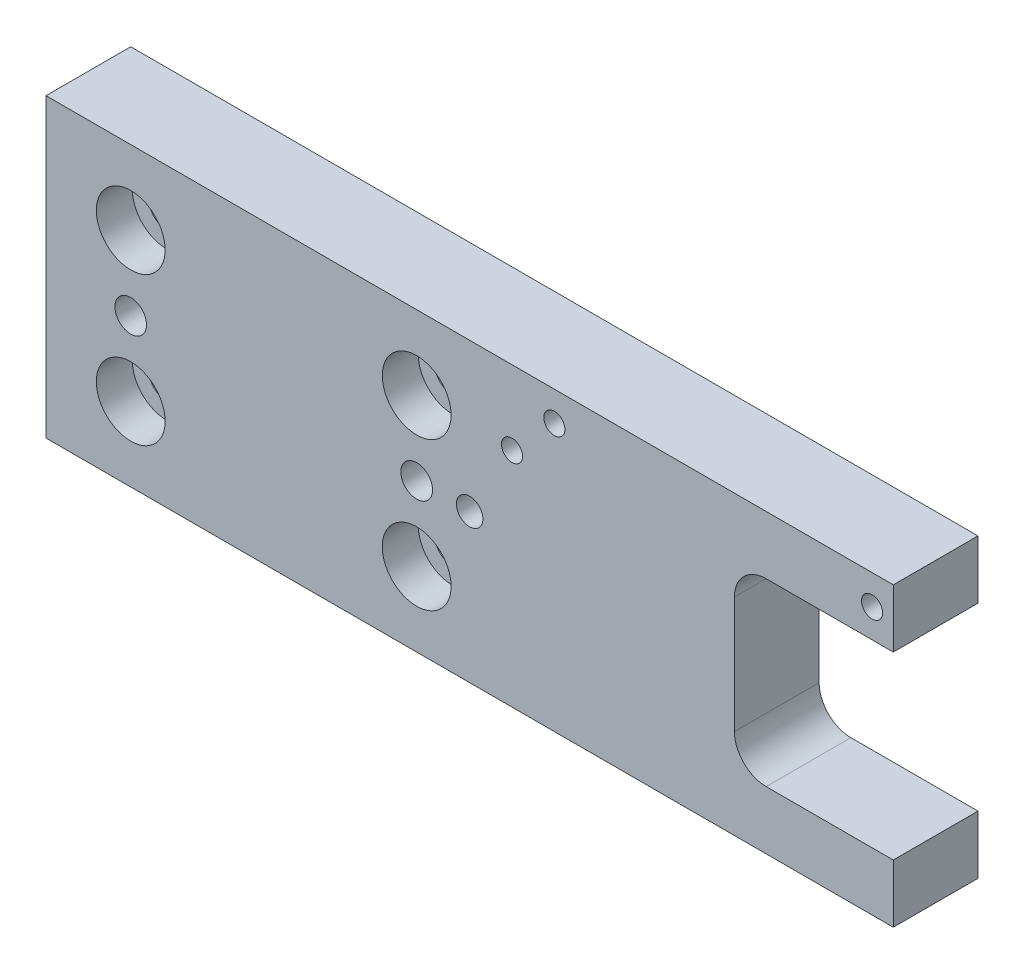
ISO-10303-21;
HEADER;
FILE_DESCRIPTION(('STEP AP214'),'2;1');
FILE_NAME('part.step','',(''),(''),'','','');
FILE_SCHEMA(('AUTOMOTIVE_DESIGN { 1 0 10303 214 1 1 1 1 }'));
ENDSEC;
DATA;
#1=APPLICATION_CONTEXT('core data for automotive mechanical design processes');
#2=APPLICATION_PROTOCOL_DEFINITION('international standard','automotive_design',2000,#1);
#3=PRODUCT_CONTEXT('',#1,'mechanical');
#4=PRODUCT('Part','Part','',(#3));
#5=PRODUCT_RELATED_PRODUCT_CATEGORY('part','',(#4));
#6=PRODUCT_DEFINITION_FORMATION('','',#4);
#7=PRODUCT_DEFINITION_CONTEXT('part definition',#1,'design');
#8=PRODUCT_DEFINITION('design','',#6,#7);
#9=PRODUCT_DEFINITION_SHAPE('','',#8);
#10=(LENGTH_UNIT() NAMED_UNIT(*) SI_UNIT(.MILLI.,.METRE.));
#11=(NAMED_UNIT(*) PLANE_ANGLE_UNIT() SI_UNIT($,.RADIAN.));
#12=(NAMED_UNIT(*) SI_UNIT($,.STERADIAN.) SOLID_ANGLE_UNIT());
#13=UNCERTAINTY_MEASURE_WITH_UNIT(LENGTH_MEASURE(1.E-05),#10,'distance_accuracy_value','');
#14=(GEOMETRIC_REPRESENTATION_CONTEXT(3) GLOBAL_UNCERTAINTY_ASSIGNED_CONTEXT((#13)) GLOBAL_UNIT_ASSIGNED_CONTEXT((#10,
#11,#12)) REPRESENTATION_CONTEXT('',''));
#15=CARTESIAN_POINT('',(0.,0.,0.));
#16=DIRECTION('',(0.,0.,1.));
#17=DIRECTION('',(1.,0.,0.));
#18=AXIS2_PLACEMENT_3D('',#15,#16,#17);
#19=CARTESIAN_POINT('',(8.00000000000003,7.,8.));
#20=DIRECTION('',(0.,0.,1.));
#21=DIRECTION('',(1.,0.,0.));
#22=AXIS2_PLACEMENT_3D('',#19,#20,#21);
#23=CYLINDRICAL_SURFACE('',#22,3.25);
#24=CARTESIAN_POINT('',(8.00000000000003,7.,8.));
#25=DIRECTION('',(0.,0.,1.));
#26=DIRECTION('',(1.,0.,0.));
#27=AXIS2_PLACEMENT_3D('',#24,#25,#26);
#28=CIRCLE('',#27,3.25);
#29=CARTESIAN_POINT('',(11.25,7.,8.));
#30=VERTEX_POINT('',#29);
#31=EDGE_CURVE('E271',#30,#30,#28,.F.);
#32=ORIENTED_EDGE('',*,*,#31,.F.);
#33=EDGE_LOOP('',(#32));
#34=FACE_BOUND('',#33,.T.);
#35=CARTESIAN_POINT('',(8.00000000000003,7.,4.6));
#36=DIRECTION('',(0.,0.,1.));
#37=DIRECTION('',(1.,0.,0.));
#38=AXIS2_PLACEMENT_3D('',#35,#36,#37);
#39=CIRCLE('',#38,3.25);
#40=CARTESIAN_POINT('',(11.25,7.,4.6));
#41=VERTEX_POINT('',#40);
#42=EDGE_CURVE('E19',#41,#41,#39,.F.);
#43=ORIENTED_EDGE('',*,*,#42,.T.);
#44=EDGE_LOOP('',(#43));
#45=FACE_BOUND('',#44,.T.);
#46=ADVANCED_FACE('F16',(#34,#45),#23,.F.);
#47=CARTESIAN_POINT('',(35.,7.,8.));
#48=DIRECTION('',(0.,0.,1.));
#49=DIRECTION('',(1.,0.,0.));
#50=AXIS2_PLACEMENT_3D('',#47,#48,#49);
#51=CYLINDRICAL_SURFACE('',#50,3.25);
#52=CARTESIAN_POINT('',(35.,7.,8.));
#53=DIRECTION('',(0.,0.,1.));
#54=DIRECTION('',(1.,0.,0.));
#55=AXIS2_PLACEMENT_3D('',#52,#53,#54);
#56=CIRCLE('',#55,3.25);
#57=CARTESIAN_POINT('',(38.25,7.,8.));
#58=VERTEX_POINT('',#57);
#59=EDGE_CURVE('E268',#58,#58,#56,.F.);
#60=ORIENTED_EDGE('',*,*,#59,.F.);
#61=EDGE_LOOP('',(#60));
#62=FACE_BOUND('',#61,.T.);
#63=CARTESIAN_POINT('',(35.,7.,4.6));
#64=DIRECTION('',(0.,0.,1.));
#65=DIRECTION('',(1.,0.,0.));
#66=AXIS2_PLACEMENT_3D('',#63,#64,#65);
#67=CIRCLE('',#66,3.25);
#68=CARTESIAN_POINT('',(38.25,7.,4.6));
#69=VERTEX_POINT('',#68);
#70=EDGE_CURVE('E279',#69,#69,#67,.F.);
#71=ORIENTED_EDGE('',*,*,#70,.T.);
#72=EDGE_LOOP('',(#71));
#73=FACE_BOUND('',#72,.T.);
#74=ADVANCED_FACE('F389',(#62,#73),#51,.F.);
#75=CARTESIAN_POINT('',(35.,-7.,8.));
#76=DIRECTION('',(0.,0.,1.));
#77=DIRECTION('',(1.,0.,0.));
#78=AXIS2_PLACEMENT_3D('',#75,#76,#77);
#79=CYLINDRICAL_SURFACE('',#78,3.25);
#80=CARTESIAN_POINT('',(35.,-7.,8.));
#81=DIRECTION('',(0.,0.,1.));
#82=DIRECTION('',(1.,0.,0.));
#83=AXIS2_PLACEMENT_3D('',#80,#81,#82);
#84=CIRCLE('',#83,3.25);
#85=CARTESIAN_POINT('',(38.25,-7.,8.));
#86=VERTEX_POINT('',#85);
#87=EDGE_CURVE('E265',#86,#86,#84,.F.);
#88=ORIENTED_EDGE('',*,*,#87,.F.);
#89=EDGE_LOOP('',(#88));
#90=FACE_BOUND('',#89,.T.);
#91=CARTESIAN_POINT('',(35.,-7.,4.6));
#92=DIRECTION('',(0.,0.,1.));
#93=DIRECTION('',(1.,0.,0.));
#94=AXIS2_PLACEMENT_3D('',#91,#92,#93);
#95=CIRCLE('',#94,3.25);
#96=CARTESIAN_POINT('',(38.25,-7.,4.6));
#97=VERTEX_POINT('',#96);
#98=EDGE_CURVE('E277',#97,#97,#95,.F.);
#99=ORIENTED_EDGE('',*,*,#98,.T.);
#100=EDGE_LOOP('',(#99));
#101=FACE_BOUND('',#100,.T.);
#102=ADVANCED_FACE('F386',(#90,#101),#79,.F.);
#103=CARTESIAN_POINT('',(8.00000000000003,-7.,8.));
#104=DIRECTION('',(0.,0.,1.));
#105=DIRECTION('',(1.,0.,0.));
#106=AXIS2_PLACEMENT_3D('',#103,#104,#105);
#107=CYLINDRICAL_SURFACE('',#106,3.25);
#108=CARTESIAN_POINT('',(8.00000000000003,-7.,8.));
#109=DIRECTION('',(0.,0.,1.));
#110=DIRECTION('',(1.,0.,0.));
#111=AXIS2_PLACEMENT_3D('',#108,#109,#110);
#112=CIRCLE('',#111,3.25);
#113=CARTESIAN_POINT('',(11.25,-7.,8.));
#114=VERTEX_POINT('',#113);
#115=EDGE_CURVE('E262',#114,#114,#112,.F.);
#116=ORIENTED_EDGE('',*,*,#115,.F.);
#117=EDGE_LOOP('',(#116));
#118=FACE_BOUND('',#117,.T.);
#119=CARTESIAN_POINT('',(8.00000000000003,-7.,4.6));
#120=DIRECTION('',(0.,0.,1.));
#121=DIRECTION('',(1.,0.,0.));
#122=AXIS2_PLACEMENT_3D('',#119,#120,#121);
#123=CIRCLE('',#122,3.25);
#124=CARTESIAN_POINT('',(11.25,-7.,4.6));
#125=VERTEX_POINT('',#124);
#126=EDGE_CURVE('E274',#125,#125,#123,.F.);
#127=ORIENTED_EDGE('',*,*,#126,.T.);
#128=EDGE_LOOP('',(#127));
#129=FACE_BOUND('',#128,.T.);
#130=ADVANCED_FACE('F291',(#118,#129),#107,.F.);
#131=CARTESIAN_POINT('',(9.70000000000003,7.,4.6));
#132=DIRECTION('',(0.,0.,-1.));
#133=DIRECTION('',(-1.,0.,0.));
#134=AXIS2_PLACEMENT_3D('',#131,#132,#133);
#135=PLANE('',#134);
#136=ORIENTED_EDGE('',*,*,#42,.F.);
#137=EDGE_LOOP('',(#136));
#138=FACE_BOUND('',#137,.T.);
#139=CARTESIAN_POINT('',(8.00000000000003,7.,4.6));
#140=DIRECTION('',(0.,0.,1.));
#141=DIRECTION('',(1.,0.,0.));
#142=AXIS2_PLACEMENT_3D('',#139,#140,#141);
#143=CIRCLE('',#142,1.7);
#144=CARTESIAN_POINT('',(9.70000000000003,7.,4.6));
#145=VERTEX_POINT('',#144);
#146=EDGE_CURVE('E241',#145,#145,#143,.F.);
#147=ORIENTED_EDGE('',*,*,#146,.T.);
#148=EDGE_LOOP('',(#147));
#149=FACE_BOUND('',#148,.T.);
#150=ADVANCED_FACE('F287',(#138,#149),#135,.F.);
#151=CARTESIAN_POINT('',(36.7,7.,4.6));
#152=DIRECTION('',(0.,0.,-1.));
#153=DIRECTION('',(-1.,0.,0.));
#154=AXIS2_PLACEMENT_3D('',#151,#152,#153);
#155=PLANE('',#154);
#156=ORIENTED_EDGE('',*,*,#70,.F.);
#157=EDGE_LOOP('',(#156));
#158=FACE_BOUND('',#157,.T.);
#159=CARTESIAN_POINT('',(35.,7.,4.6));
#160=DIRECTION('',(0.,0.,1.));
#161=DIRECTION('',(1.,0.,0.));
#162=AXIS2_PLACEMENT_3D('',#159,#160,#161);
#163=CIRCLE('',#162,1.7);
#164=CARTESIAN_POINT('',(36.7,7.,4.6));
#165=VERTEX_POINT('',#164);
#166=EDGE_CURVE('E238',#165,#165,#163,.F.);
#167=ORIENTED_EDGE('',*,*,#166,.T.);
#168=EDGE_LOOP('',(#167));
#169=FACE_BOUND('',#168,.T.);
#170=ADVANCED_FACE('F290',(#158,#169),#155,.F.);
#171=CARTESIAN_POINT('',(36.7,-7.,4.6));
#172=DIRECTION('',(0.,0.,-1.));
#173=DIRECTION('',(-1.,0.,0.));
#174=AXIS2_PLACEMENT_3D('',#171,#172,#173);
#175=PLANE('',#174);
#176=ORIENTED_EDGE('',*,*,#98,.F.);
#177=EDGE_LOOP('',(#176));
#178=FACE_BOUND('',#177,.T.);
#179=CARTESIAN_POINT('',(35.,-7.,4.6));
#180=DIRECTION('',(0.,0.,1.));
#181=DIRECTION('',(1.,0.,0.));
#182=AXIS2_PLACEMENT_3D('',#179,#180,#181);
#183=CIRCLE('',#182,1.7);
#184=CARTESIAN_POINT('',(36.7,-7.,4.6));
#185=VERTEX_POINT('',#184);
#186=EDGE_CURVE('E235',#185,#185,#183,.F.);
#187=ORIENTED_EDGE('',*,*,#186,.T.);
#188=EDGE_LOOP('',(#187));
#189=FACE_BOUND('',#188,.T.);
#190=ADVANCED_FACE('F368',(#178,#189),#175,.F.);
#191=CARTESIAN_POINT('',(9.70000000000003,-7.,4.6));
#192=DIRECTION('',(0.,0.,-1.));
#193=DIRECTION('',(-1.,0.,0.));
#194=AXIS2_PLACEMENT_3D('',#191,#192,#193);
#195=PLANE('',#194);
#196=ORIENTED_EDGE('',*,*,#126,.F.);
#197=EDGE_LOOP('',(#196));
#198=FACE_BOUND('',#197,.T.);
#199=CARTESIAN_POINT('',(8.00000000000003,-7.,4.6));
#200=DIRECTION('',(0.,0.,1.));
#201=DIRECTION('',(1.,0.,0.));
#202=AXIS2_PLACEMENT_3D('',#199,#200,#201);
#203=CIRCLE('',#202,1.7);
#204=CARTESIAN_POINT('',(9.70000000000003,-7.,4.6));
#205=VERTEX_POINT('',#204);
#206=EDGE_CURVE('E183',#205,#205,#203,.F.);
#207=ORIENTED_EDGE('',*,*,#206,.T.);
#208=EDGE_LOOP('',(#207));
#209=FACE_BOUND('',#208,.T.);
#210=ADVANCED_FACE('F370',(#198,#209),#195,.F.);
#211=CARTESIAN_POINT('',(0.,-14.,8.));
#212=DIRECTION('',(0.,0.,1.));
#213=DIRECTION('',(1.,0.,0.));
#214=AXIS2_PLACEMENT_3D('',#211,#212,#213);
#215=PLANE('',#214);
#216=DIRECTION('',(1.,0.,0.));
#217=VECTOR('',#216,1.);
#218=CARTESIAN_POINT('',(80.,-8.50000000000001,8.));
#219=LINE('',#218,#217);
#220=CARTESIAN_POINT('',(80.,-8.50000000000001,8.));
#221=VERTEX_POINT('',#220);
#222=CARTESIAN_POINT('',(68.,-8.50000000000001,8.));
#223=VERTEX_POINT('',#222);
#224=EDGE_CURVE('E90',#221,#223,#219,.F.);
#225=ORIENTED_EDGE('',*,*,#224,.T.);
#226=CARTESIAN_POINT('',(68.,-5.50000000000001,8.));
#227=DIRECTION('',(0.,0.,1.));
#228=DIRECTION('',(1.,0.,0.));
#229=AXIS2_PLACEMENT_3D('',#226,#227,#228);
#230=CIRCLE('',#229,3.);
#231=CARTESIAN_POINT('',(65.,-5.50000000000001,8.));
#232=VERTEX_POINT('',#231);
#233=EDGE_CURVE('E92',#223,#232,#230,.F.);
#234=ORIENTED_EDGE('',*,*,#233,.T.);
#235=DIRECTION('',(0.,1.,0.));
#236=VECTOR('',#235,1.);
#237=CARTESIAN_POINT('',(65.,-8.50000000000001,8.));
#238=LINE('',#237,#236);
#239=CARTESIAN_POINT('',(65.,5.49999999999999,8.));
#240=VERTEX_POINT('',#239);
#241=EDGE_CURVE('E96',#232,#240,#238,.T.);
#242=ORIENTED_EDGE('',*,*,#241,.T.);
#243=CARTESIAN_POINT('',(68.,5.49999999999999,8.));
#244=DIRECTION('',(0.,0.,1.));
#245=DIRECTION('',(1.,0.,0.));
#246=AXIS2_PLACEMENT_3D('',#243,#244,#245);
#247=CIRCLE('',#246,3.);
#248=CARTESIAN_POINT('',(68.,8.49999999999999,8.));
#249=VERTEX_POINT('',#248);
#250=EDGE_CURVE('E231',#240,#249,#247,.F.);
#251=ORIENTED_EDGE('',*,*,#250,.T.);
#252=DIRECTION('',(-1.,0.,0.));
#253=VECTOR('',#252,1.);
#254=CARTESIAN_POINT('',(80.,8.49999999999999,8.));
#255=LINE('',#254,#253);
#256=CARTESIAN_POINT('',(80.,8.49999999999999,8.));
#257=VERTEX_POINT('',#256);
#258=EDGE_CURVE('E169',#249,#257,#255,.F.);
#259=ORIENTED_EDGE('',*,*,#258,.T.);
#260=DIRECTION('',(0.,-1.,0.));
#261=VECTOR('',#260,1.);
#262=CARTESIAN_POINT('',(80.,14.,8.));
#263=LINE('',#262,#261);
#264=CARTESIAN_POINT('',(80.,14.,8.));
#265=VERTEX_POINT('',#264);
#266=EDGE_CURVE('E176',#257,#265,#263,.F.);
#267=ORIENTED_EDGE('',*,*,#266,.T.);
#268=DIRECTION('',(1.,0.,0.));
#269=VECTOR('',#268,1.);
#270=CARTESIAN_POINT('',(0.,14.,8.));
#271=LINE('',#270,#269);
#272=CARTESIAN_POINT('',(0.,14.,8.));
#273=VERTEX_POINT('',#272);
#274=EDGE_CURVE('E158',#265,#273,#271,.F.);
#275=ORIENTED_EDGE('',*,*,#274,.T.);
#276=DIRECTION('',(0.,1.,0.));
#277=VECTOR('',#276,1.);
#278=CARTESIAN_POINT('',(0.,14.,8.));
#279=LINE('',#278,#277);
#280=CARTESIAN_POINT('',(0.,-14.,8.));
#281=VERTEX_POINT('',#280);
#282=EDGE_CURVE('E147',#273,#281,#279,.F.);
#283=ORIENTED_EDGE('',*,*,#282,.T.);
#284=DIRECTION('',(-1.,0.,0.));
#285=VECTOR('',#284,1.);
#286=CARTESIAN_POINT('',(0.,-14.,8.));
#287=LINE('',#286,#285);
#288=CARTESIAN_POINT('',(80.,-14.,8.));
#289=VERTEX_POINT('',#288);
#290=EDGE_CURVE('E136',#281,#289,#287,.F.);
#291=ORIENTED_EDGE('',*,*,#290,.T.);
#292=DIRECTION('',(0.,-1.,0.));
#293=VECTOR('',#292,1.);
#294=CARTESIAN_POINT('',(80.,14.,8.));
#295=LINE('',#294,#293);
#296=EDGE_CURVE('E123',#289,#221,#295,.F.);
#297=ORIENTED_EDGE('',*,*,#296,.T.);
#298=EDGE_LOOP('',(#225,#234,#242,#251,#259,#267,#275,#283,#291,#297));
#299=FACE_BOUND('',#298,.T.);
#300=ORIENTED_EDGE('',*,*,#115,.T.);
#301=EDGE_LOOP('',(#300));
#302=FACE_BOUND('',#301,.T.);
#303=ORIENTED_EDGE('',*,*,#87,.T.);
#304=EDGE_LOOP('',(#303));
#305=FACE_BOUND('',#304,.T.);
#306=ORIENTED_EDGE('',*,*,#59,.T.);
#307=EDGE_LOOP('',(#306));
#308=FACE_BOUND('',#307,.T.);
#309=ORIENTED_EDGE('',*,*,#31,.T.);
#310=EDGE_LOOP('',(#309));
#311=FACE_BOUND('',#310,.T.);
#312=CARTESIAN_POINT('',(48.,11.2,8.));
#313=DIRECTION('',(0.,0.,1.));
#314=DIRECTION('',(1.,0.,0.));
#315=AXIS2_PLACEMENT_3D('',#312,#313,#314);
#316=CIRCLE('',#315,0.994999999999996);
#317=CARTESIAN_POINT('',(48.995,11.2,8.));
#318=VERTEX_POINT('',#317);
#319=EDGE_CURVE('E244',#318,#318,#316,.F.);
#320=ORIENTED_EDGE('',*,*,#319,.T.);
#321=EDGE_LOOP('',(#320));
#322=FACE_BOUND('',#321,.T.);
#323=CARTESIAN_POINT('',(78.,11.2,8.));
#324=DIRECTION('',(0.,0.,1.));
#325=DIRECTION('',(1.,0.,0.));
#326=AXIS2_PLACEMENT_3D('',#323,#324,#325);
#327=CIRCLE('',#326,0.994999999999996);
#328=CARTESIAN_POINT('',(78.995,11.2,8.));
#329=VERTEX_POINT('',#328);
#330=EDGE_CURVE('E247',#329,#329,#327,.F.);
#331=ORIENTED_EDGE('',*,*,#330,.T.);
#332=EDGE_LOOP('',(#331));
#333=FACE_BOUND('',#332,.T.);
#334=CARTESIAN_POINT('',(44.,7.,8.));
#335=DIRECTION('',(0.,0.,1.));
#336=DIRECTION('',(1.,0.,0.));
#337=AXIS2_PLACEMENT_3D('',#334,#335,#336);
#338=CIRCLE('',#337,0.995000000000003);
#339=CARTESIAN_POINT('',(44.995,7.,8.));
#340=VERTEX_POINT('',#339);
#341=EDGE_CURVE('E250',#340,#340,#338,.F.);
#342=ORIENTED_EDGE('',*,*,#341,.T.);
#343=EDGE_LOOP('',(#342));
#344=FACE_BOUND('',#343,.T.);
#345=CARTESIAN_POINT('',(35.,0.,8.));
#346=DIRECTION('',(0.,0.,1.));
#347=DIRECTION('',(1.,0.,0.));
#348=AXIS2_PLACEMENT_3D('',#345,#346,#347);
#349=CIRCLE('',#348,1.495);
#350=CARTESIAN_POINT('',(36.495,0.,8.));
#351=VERTEX_POINT('',#350);
#352=EDGE_CURVE('E253',#351,#351,#349,.F.);
#353=ORIENTED_EDGE('',*,*,#352,.T.);
#354=EDGE_LOOP('',(#353));
#355=FACE_BOUND('',#354,.T.);
#356=CARTESIAN_POINT('',(8.00000000000002,0.,8.));
#357=DIRECTION('',(0.,0.,1.));
#358=DIRECTION('',(1.,0.,0.));
#359=AXIS2_PLACEMENT_3D('',#356,#357,#358);
#360=CIRCLE('',#359,1.495);
#361=CARTESIAN_POINT('',(9.49500000000002,0.,8.));
#362=VERTEX_POINT('',#361);
#363=EDGE_CURVE('E256',#362,#362,#360,.F.);
#364=ORIENTED_EDGE('',*,*,#363,.T.);
#365=EDGE_LOOP('',(#364));
#366=FACE_BOUND('',#365,.T.);
#367=CARTESIAN_POINT('',(40.,0.,8.));
#368=DIRECTION('',(0.,0.,1.));
#369=DIRECTION('',(1.,0.,0.));
#370=AXIS2_PLACEMENT_3D('',#367,#368,#369);
#371=CIRCLE('',#370,1.24999999999999);
#372=CARTESIAN_POINT('',(41.25,0.,8.));
#373=VERTEX_POINT('',#372);
#374=EDGE_CURVE('E259',#373,#373,#371,.F.);
#375=ORIENTED_EDGE('',*,*,#374,.T.);
#376=EDGE_LOOP('',(#375));
#377=FACE_BOUND('',#376,.T.);
#378=ADVANCED_FACE('F94',(#299,#302,#305,#308,#311,#322,#333,#344,#355,#366,#377),#215,.T.);
#379=CARTESIAN_POINT('',(40.,0.,8.));
#380=DIRECTION('',(0.,0.,1.));
#381=DIRECTION('',(1.,0.,0.));
#382=AXIS2_PLACEMENT_3D('',#379,#380,#381);
#383=CYLINDRICAL_SURFACE('',#382,1.24999999999999);
#384=CARTESIAN_POINT('',(40.,0.,0.));
#385=DIRECTION('',(0.,0.,1.));
#386=DIRECTION('',(1.,0.,0.));
#387=AXIS2_PLACEMENT_3D('',#384,#385,#386);
#388=CIRCLE('',#387,1.24999999999999);
#389=CARTESIAN_POINT('',(41.25,0.,0.));
#390=VERTEX_POINT('',#389);
#391=EDGE_CURVE('E179',#390,#390,#388,.F.);
#392=ORIENTED_EDGE('',*,*,#391,.T.);
#393=EDGE_LOOP('',(#392));
#394=FACE_BOUND('',#393,.T.);
#395=ORIENTED_EDGE('',*,*,#374,.F.);
#396=EDGE_LOOP('',(#395));
#397=FACE_BOUND('',#396,.T.);
#398=ADVANCED_FACE('F401',(#394,#397),#383,.F.);
#399=CARTESIAN_POINT('',(8.00000000000002,0.,8.));
#400=DIRECTION('',(0.,0.,1.));
#401=DIRECTION('',(1.,0.,0.));
#402=AXIS2_PLACEMENT_3D('',#399,#400,#401);
#403=CYLINDRICAL_SURFACE('',#402,1.495);
#404=CARTESIAN_POINT('',(8.00000000000002,0.,0.));
#405=DIRECTION('',(0.,0.,1.));
#406=DIRECTION('',(1.,0.,0.));
#407=AXIS2_PLACEMENT_3D('',#404,#405,#406);
#408=CIRCLE('',#407,1.495);
#409=CARTESIAN_POINT('',(9.49500000000002,0.,0.));
#410=VERTEX_POINT('',#409);
#411=EDGE_CURVE('E226',#410,#410,#408,.F.);
#412=ORIENTED_EDGE('',*,*,#411,.T.);
#413=EDGE_LOOP('',(#412));
#414=FACE_BOUND('',#413,.T.);
#415=ORIENTED_EDGE('',*,*,#363,.F.);
#416=EDGE_LOOP('',(#415));
#417=FACE_BOUND('',#416,.T.);
#418=ADVANCED_FACE('F417',(#414,#417),#403,.F.);
#419=CARTESIAN_POINT('',(35.,0.,8.));
#420=DIRECTION('',(0.,0.,1.));
#421=DIRECTION('',(1.,0.,0.));
#422=AXIS2_PLACEMENT_3D('',#419,#420,#421);
#423=CYLINDRICAL_SURFACE('',#422,1.495);
#424=CARTESIAN_POINT('',(35.,0.,0.));
#425=DIRECTION('',(0.,0.,1.));
#426=DIRECTION('',(1.,0.,0.));
#427=AXIS2_PLACEMENT_3D('',#424,#425,#426);
#428=CIRCLE('',#427,1.495);
#429=CARTESIAN_POINT('',(36.495,0.,0.));
#430=VERTEX_POINT('',#429);
#431=EDGE_CURVE('E223',#430,#430,#428,.F.);
#432=ORIENTED_EDGE('',*,*,#431,.T.);
#433=EDGE_LOOP('',(#432));
#434=FACE_BOUND('',#433,.T.);
#435=ORIENTED_EDGE('',*,*,#352,.F.);
#436=EDGE_LOOP('',(#435));
#437=FACE_BOUND('',#436,.T.);
#438=ADVANCED_FACE('F423',(#434,#437),#423,.F.);
#439=CARTESIAN_POINT('',(44.,7.,8.));
#440=DIRECTION('',(0.,0.,1.));
#441=DIRECTION('',(1.,0.,0.));
#442=AXIS2_PLACEMENT_3D('',#439,#440,#441);
#443=CYLINDRICAL_SURFACE('',#442,0.995000000000003);
#444=CARTESIAN_POINT('',(44.,7.,0.));
#445=DIRECTION('',(0.,0.,1.));
#446=DIRECTION('',(1.,0.,0.));
#447=AXIS2_PLACEMENT_3D('',#444,#445,#446);
#448=CIRCLE('',#447,0.995000000000003);
#449=CARTESIAN_POINT('',(44.995,7.,0.));
#450=VERTEX_POINT('',#449);
#451=EDGE_CURVE('E220',#450,#450,#448,.F.);
#452=ORIENTED_EDGE('',*,*,#451,.T.);
#453=EDGE_LOOP('',(#452));
#454=FACE_BOUND('',#453,.T.);
#455=ORIENTED_EDGE('',*,*,#341,.F.);
#456=EDGE_LOOP('',(#455));
#457=FACE_BOUND('',#456,.T.);
#458=ADVANCED_FACE('F429',(#454,#457),#443,.F.);
#459=CARTESIAN_POINT('',(78.,11.2,8.));
#460=DIRECTION('',(0.,0.,1.));
#461=DIRECTION('',(1.,0.,0.));
#462=AXIS2_PLACEMENT_3D('',#459,#460,#461);
#463=CYLINDRICAL_SURFACE('',#462,0.994999999999996);
#464=CARTESIAN_POINT('',(78.,11.2,0.));
#465=DIRECTION('',(0.,0.,1.));
#466=DIRECTION('',(1.,0.,0.));
#467=AXIS2_PLACEMENT_3D('',#464,#465,#466);
#468=CIRCLE('',#467,0.994999999999996);
#469=CARTESIAN_POINT('',(78.995,11.2,0.));
#470=VERTEX_POINT('',#469);
#471=EDGE_CURVE('E217',#470,#470,#468,.F.);
#472=ORIENTED_EDGE('',*,*,#471,.T.);
#473=EDGE_LOOP('',(#472));
#474=FACE_BOUND('',#473,.T.);
#475=ORIENTED_EDGE('',*,*,#330,.F.);
#476=EDGE_LOOP('',(#475));
#477=FACE_BOUND('',#476,.T.);
#478=ADVANCED_FACE('F309',(#474,#477),#463,.F.);
#479=CARTESIAN_POINT('',(48.,11.2,8.));
#480=DIRECTION('',(0.,0.,1.));
#481=DIRECTION('',(1.,0.,0.));
#482=AXIS2_PLACEMENT_3D('',#479,#480,#481);
#483=CYLINDRICAL_SURFACE('',#482,0.994999999999996);
#484=CARTESIAN_POINT('',(48.,11.2,0.));
#485=DIRECTION('',(0.,0.,1.));
#486=DIRECTION('',(1.,0.,0.));
#487=AXIS2_PLACEMENT_3D('',#484,#485,#486);
#488=CIRCLE('',#487,0.994999999999996);
#489=CARTESIAN_POINT('',(48.995,11.2,0.));
#490=VERTEX_POINT('',#489);
#491=EDGE_CURVE('E214',#490,#490,#488,.F.);
#492=ORIENTED_EDGE('',*,*,#491,.T.);
#493=EDGE_LOOP('',(#492));
#494=FACE_BOUND('',#493,.T.);
#495=ORIENTED_EDGE('',*,*,#319,.F.);
#496=EDGE_LOOP('',(#495));
#497=FACE_BOUND('',#496,.T.);
#498=ADVANCED_FACE('F298',(#494,#497),#483,.F.);
#499=CARTESIAN_POINT('',(8.00000000000003,7.,8.));
#500=DIRECTION('',(0.,0.,1.));
#501=DIRECTION('',(1.,0.,0.));
#502=AXIS2_PLACEMENT_3D('',#499,#500,#501);
#503=CYLINDRICAL_SURFACE('',#502,1.7);
#504=CARTESIAN_POINT('',(8.00000000000003,7.,0.));
#505=DIRECTION('',(0.,0.,1.));
#506=DIRECTION('',(1.,0.,0.));
#507=AXIS2_PLACEMENT_3D('',#504,#505,#506);
#508=CIRCLE('',#507,1.7);
#509=CARTESIAN_POINT('',(9.70000000000003,7.,0.));
#510=VERTEX_POINT('',#509);
#511=EDGE_CURVE('E211',#510,#510,#508,.F.);
#512=ORIENTED_EDGE('',*,*,#511,.T.);
#513=EDGE_LOOP('',(#512));
#514=FACE_BOUND('',#513,.T.);
#515=ORIENTED_EDGE('',*,*,#146,.F.);
#516=EDGE_LOOP('',(#515));
#517=FACE_BOUND('',#516,.T.);
#518=ADVANCED_FACE('F295',(#514,#517),#503,.F.);
#519=CARTESIAN_POINT('',(35.,7.,8.));
#520=DIRECTION('',(0.,0.,1.));
#521=DIRECTION('',(1.,0.,0.));
#522=AXIS2_PLACEMENT_3D('',#519,#520,#521);
#523=CYLINDRICAL_SURFACE('',#522,1.7);
#524=CARTESIAN_POINT('',(35.,7.,0.));
#525=DIRECTION('',(0.,0.,1.));
#526=DIRECTION('',(1.,0.,0.));
#527=AXIS2_PLACEMENT_3D('',#524,#525,#526);
#528=CIRCLE('',#527,1.7);
#529=CARTESIAN_POINT('',(36.7,7.,0.));
#530=VERTEX_POINT('',#529);
#531=EDGE_CURVE('E208',#530,#530,#528,.F.);
#532=ORIENTED_EDGE('',*,*,#531,.T.);
#533=EDGE_LOOP('',(#532));
#534=FACE_BOUND('',#533,.T.);
#535=ORIENTED_EDGE('',*,*,#166,.F.);
#536=EDGE_LOOP('',(#535));
#537=FACE_BOUND('',#536,.T.);
#538=ADVANCED_FACE('F297',(#534,#537),#523,.F.);
#539=CARTESIAN_POINT('',(35.,-7.,8.));
#540=DIRECTION('',(0.,0.,1.));
#541=DIRECTION('',(1.,0.,0.));
#542=AXIS2_PLACEMENT_3D('',#539,#540,#541);
#543=CYLINDRICAL_SURFACE('',#542,1.7);
#544=CARTESIAN_POINT('',(35.,-7.,0.));
#545=DIRECTION('',(0.,0.,1.));
#546=DIRECTION('',(1.,0.,0.));
#547=AXIS2_PLACEMENT_3D('',#544,#545,#546);
#548=CIRCLE('',#547,1.7);
#549=CARTESIAN_POINT('',(36.7,-7.,0.));
#550=VERTEX_POINT('',#549);
#551=EDGE_CURVE('E205',#550,#550,#548,.F.);
#552=ORIENTED_EDGE('',*,*,#551,.T.);
#553=EDGE_LOOP('',(#552));
#554=FACE_BOUND('',#553,.T.);
#555=ORIENTED_EDGE('',*,*,#186,.F.);
#556=EDGE_LOOP('',(#555));
#557=FACE_BOUND('',#556,.T.);
#558=ADVANCED_FACE('F306',(#554,#557),#543,.F.);
#559=CARTESIAN_POINT('',(8.00000000000003,-7.,8.));
#560=DIRECTION('',(0.,0.,1.));
#561=DIRECTION('',(1.,0.,0.));
#562=AXIS2_PLACEMENT_3D('',#559,#560,#561);
#563=CYLINDRICAL_SURFACE('',#562,1.7);
#564=CARTESIAN_POINT('',(8.00000000000003,-7.,0.));
#565=DIRECTION('',(0.,0.,1.));
#566=DIRECTION('',(1.,0.,0.));
#567=AXIS2_PLACEMENT_3D('',#564,#565,#566);
#568=CIRCLE('',#567,1.7);
#569=CARTESIAN_POINT('',(9.70000000000003,-7.,0.));
#570=VERTEX_POINT('',#569);
#571=EDGE_CURVE('E163',#570,#570,#568,.F.);
#572=ORIENTED_EDGE('',*,*,#571,.T.);
#573=EDGE_LOOP('',(#572));
#574=FACE_BOUND('',#573,.T.);
#575=ORIENTED_EDGE('',*,*,#206,.F.);
#576=EDGE_LOOP('',(#575));
#577=FACE_BOUND('',#576,.T.);
#578=ADVANCED_FACE('F355',(#574,#577),#563,.F.);
#579=CARTESIAN_POINT('',(0.,14.,8.));
#580=DIRECTION('',(0.,-1.,0.));
#581=DIRECTION('',(0.,0.,-1.));
#582=AXIS2_PLACEMENT_3D('',#579,#580,#581);
#583=PLANE('',#582);
#584=DIRECTION('',(0.,0.,1.));
#585=VECTOR('',#584,1.);
#586=CARTESIAN_POINT('',(0.,14.,8.));
#587=LINE('',#586,#585);
#588=CARTESIAN_POINT('',(0.,14.,0.));
#589=VERTEX_POINT('',#588);
#590=EDGE_CURVE('E155',#589,#273,#587,.T.);
#591=ORIENTED_EDGE('',*,*,#590,.T.);
#592=ORIENTED_EDGE('',*,*,#274,.F.);
#593=DIRECTION('',(0.,0.,1.));
#594=VECTOR('',#593,1.);
#595=CARTESIAN_POINT('',(80.,14.,8.));
#596=LINE('',#595,#594);
#597=CARTESIAN_POINT('',(80.,14.,0.));
#598=VERTEX_POINT('',#597);
#599=EDGE_CURVE('E166',#265,#598,#596,.F.);
#600=ORIENTED_EDGE('',*,*,#599,.T.);
#601=DIRECTION('',(1.,0.,0.));
#602=VECTOR('',#601,1.);
#603=CARTESIAN_POINT('',(0.,14.,0.));
#604=LINE('',#603,#602);
#605=EDGE_CURVE('E152',#598,#589,#604,.F.);
#606=ORIENTED_EDGE('',*,*,#605,.T.);
#607=EDGE_LOOP('',(#591,#592,#600,#606));
#608=FACE_BOUND('',#607,.T.);
#609=ADVANCED_FACE('F351',(#608),#583,.F.);
#610=CARTESIAN_POINT('',(0.,14.,8.));
#611=DIRECTION('',(1.,0.,0.));
#612=DIRECTION('',(0.,1.,0.));
#613=AXIS2_PLACEMENT_3D('',#610,#611,#612);
#614=PLANE('',#613);
#615=DIRECTION('',(0.,0.,1.));
#616=VECTOR('',#615,1.);
#617=CARTESIAN_POINT('',(0.,-14.,8.));
#618=LINE('',#617,#616);
#619=CARTESIAN_POINT('',(0.,-14.,0.));
#620=VERTEX_POINT('',#619);
#621=EDGE_CURVE('E144',#620,#281,#618,.T.);
#622=ORIENTED_EDGE('',*,*,#621,.T.);
#623=ORIENTED_EDGE('',*,*,#282,.F.);
#624=ORIENTED_EDGE('',*,*,#590,.F.);
#625=DIRECTION('',(0.,1.,0.));
#626=VECTOR('',#625,1.);
#627=CARTESIAN_POINT('',(0.,-14.,0.));
#628=LINE('',#627,#626);
#629=EDGE_CURVE('E141',#589,#620,#628,.F.);
#630=ORIENTED_EDGE('',*,*,#629,.T.);
#631=EDGE_LOOP('',(#622,#623,#624,#630));
#632=FACE_BOUND('',#631,.T.);
#633=ADVANCED_FACE('F347',(#632),#614,.F.);
#634=CARTESIAN_POINT('',(0.,-14.,8.));
#635=DIRECTION('',(0.,1.,0.));
#636=DIRECTION('',(-1.,0.,0.));
#637=AXIS2_PLACEMENT_3D('',#634,#635,#636);
#638=PLANE('',#637);
#639=DIRECTION('',(0.,0.,1.));
#640=VECTOR('',#639,1.);
#641=CARTESIAN_POINT('',(80.,-14.,8.));
#642=LINE('',#641,#640);
#643=CARTESIAN_POINT('',(80.,-14.,0.));
#644=VERTEX_POINT('',#643);
#645=EDGE_CURVE('E133',#644,#289,#642,.T.);
#646=ORIENTED_EDGE('',*,*,#645,.T.);
#647=ORIENTED_EDGE('',*,*,#290,.F.);
#648=ORIENTED_EDGE('',*,*,#621,.F.);
#649=DIRECTION('',(1.,0.,0.));
#650=VECTOR('',#649,1.);
#651=CARTESIAN_POINT('',(0.,-14.,0.));
#652=LINE('',#651,#650);
#653=EDGE_CURVE('E130',#620,#644,#652,.T.);
#654=ORIENTED_EDGE('',*,*,#653,.T.);
#655=EDGE_LOOP('',(#646,#647,#648,#654));
#656=FACE_BOUND('',#655,.T.);
#657=ADVANCED_FACE('F343',(#656),#638,.F.);
#658=CARTESIAN_POINT('',(80.,14.,8.));
#659=DIRECTION('',(-1.,0.,0.));
#660=DIRECTION('',(0.,-1.,0.));
#661=AXIS2_PLACEMENT_3D('',#658,#659,#660);
#662=PLANE('',#661);
#663=DIRECTION('',(0.,0.,-1.));
#664=VECTOR('',#663,1.);
#665=CARTESIAN_POINT('',(80.,-8.50000000000001,8.));
#666=LINE('',#665,#664);
#667=CARTESIAN_POINT('',(80.,-8.50000000000001,0.));
#668=VERTEX_POINT('',#667);
#669=EDGE_CURVE('E120',#668,#221,#666,.F.);
#670=ORIENTED_EDGE('',*,*,#669,.T.);
#671=ORIENTED_EDGE('',*,*,#296,.F.);
#672=ORIENTED_EDGE('',*,*,#645,.F.);
#673=DIRECTION('',(0.,1.,0.));
#674=VECTOR('',#673,1.);
#675=CARTESIAN_POINT('',(80.,-14.,0.));
#676=LINE('',#675,#674);
#677=EDGE_CURVE('E126',#644,#668,#676,.T.);
#678=ORIENTED_EDGE('',*,*,#677,.T.);
#679=EDGE_LOOP('',(#670,#671,#672,#678));
#680=FACE_BOUND('',#679,.T.);
#681=ADVANCED_FACE('F339',(#680),#662,.F.);
#682=CARTESIAN_POINT('',(80.,-8.50000000000001,8.));
#683=DIRECTION('',(0.,-1.,0.));
#684=DIRECTION('',(0.,0.,-1.));
#685=AXIS2_PLACEMENT_3D('',#682,#683,#684);
#686=PLANE('',#685);
#687=DIRECTION('',(0.,0.,1.));
#688=VECTOR('',#687,1.);
#689=CARTESIAN_POINT('',(68.,-8.50000000000001,8.));
#690=LINE('',#689,#688);
#691=CARTESIAN_POINT('',(68.,-8.50000000000001,0.));
#692=VERTEX_POINT('',#691);
#693=EDGE_CURVE('E102',#692,#223,#690,.T.);
#694=ORIENTED_EDGE('',*,*,#693,.T.);
#695=ORIENTED_EDGE('',*,*,#224,.F.);
#696=ORIENTED_EDGE('',*,*,#669,.F.);
#697=DIRECTION('',(1.,0.,0.));
#698=VECTOR('',#697,1.);
#699=CARTESIAN_POINT('',(0.,-8.50000000000001,0.));
#700=LINE('',#699,#698);
#701=EDGE_CURVE('E129',#668,#692,#700,.F.);
#702=ORIENTED_EDGE('',*,*,#701,.T.);
#703=EDGE_LOOP('',(#694,#695,#696,#702));
#704=FACE_BOUND('',#703,.T.);
#705=ADVANCED_FACE('F336',(#704),#686,.F.);
#706=CARTESIAN_POINT('',(68.,-5.50000000000001,8.));
#707=DIRECTION('',(0.,0.,1.));
#708=DIRECTION('',(1.,0.,0.));
#709=AXIS2_PLACEMENT_3D('',#706,#707,#708);
#710=CYLINDRICAL_SURFACE('',#709,3.);
#711=ORIENTED_EDGE('',*,*,#693,.F.);
#712=CARTESIAN_POINT('',(68.,-5.50000000000001,0.));
#713=DIRECTION('',(0.,0.,1.));
#714=DIRECTION('',(1.,0.,0.));
#715=AXIS2_PLACEMENT_3D('',#712,#713,#714);
#716=CIRCLE('',#715,3.);
#717=CARTESIAN_POINT('',(65.,-5.50000000000001,0.));
#718=VERTEX_POINT('',#717);
#719=EDGE_CURVE('E114',#692,#718,#716,.F.);
#720=ORIENTED_EDGE('',*,*,#719,.T.);
#721=DIRECTION('',(0.,0.,1.));
#722=VECTOR('',#721,1.);
#723=CARTESIAN_POINT('',(65.,-5.50000000000001,8.));
#724=LINE('',#723,#722);
#725=EDGE_CURVE('E101',#718,#232,#724,.T.);
#726=ORIENTED_EDGE('',*,*,#725,.T.);
#727=ORIENTED_EDGE('',*,*,#233,.F.);
#728=EDGE_LOOP('',(#711,#720,#726,#727));
#729=FACE_BOUND('',#728,.T.);
#730=ADVANCED_FACE('F112',(#729),#710,.F.);
#731=CARTESIAN_POINT('',(65.,-8.50000000000001,8.));
#732=DIRECTION('',(-1.,0.,0.));
#733=DIRECTION('',(0.,0.,1.));
#734=AXIS2_PLACEMENT_3D('',#731,#732,#733);
#735=PLANE('',#734);
#736=ORIENTED_EDGE('',*,*,#725,.F.);
#737=DIRECTION('',(0.,1.,0.));
#738=VECTOR('',#737,1.);
#739=CARTESIAN_POINT('',(65.,-14.,0.));
#740=LINE('',#739,#738);
#741=CARTESIAN_POINT('',(65.,5.49999999999999,0.));
#742=VERTEX_POINT('',#741);
#743=EDGE_CURVE('E201',#718,#742,#740,.T.);
#744=ORIENTED_EDGE('',*,*,#743,.T.);
#745=DIRECTION('',(0.,0.,1.));
#746=VECTOR('',#745,1.);
#747=CARTESIAN_POINT('',(65.,5.49999999999999,8.));
#748=LINE('',#747,#746);
#749=EDGE_CURVE('E109',#742,#240,#748,.T.);
#750=ORIENTED_EDGE('',*,*,#749,.T.);
#751=ORIENTED_EDGE('',*,*,#241,.F.);
#752=EDGE_LOOP('',(#736,#744,#750,#751));
#753=FACE_BOUND('',#752,.T.);
#754=ADVANCED_FACE('F106',(#753),#735,.F.);
#755=CARTESIAN_POINT('',(68.,5.49999999999999,8.));
#756=DIRECTION('',(0.,0.,1.));
#757=DIRECTION('',(1.,0.,0.));
#758=AXIS2_PLACEMENT_3D('',#755,#756,#757);
#759=CYLINDRICAL_SURFACE('',#758,3.);
#760=ORIENTED_EDGE('',*,*,#749,.F.);
#761=CARTESIAN_POINT('',(68.,5.49999999999999,0.));
#762=DIRECTION('',(0.,0.,1.));
#763=DIRECTION('',(1.,0.,0.));
#764=AXIS2_PLACEMENT_3D('',#761,#762,#763);
#765=CIRCLE('',#764,3.);
#766=CARTESIAN_POINT('',(68.,8.49999999999999,0.));
#767=VERTEX_POINT('',#766);
#768=EDGE_CURVE('E198',#742,#767,#765,.F.);
#769=ORIENTED_EDGE('',*,*,#768,.T.);
#770=DIRECTION('',(0.,0.,1.));
#771=VECTOR('',#770,1.);
#772=CARTESIAN_POINT('',(68.,8.49999999999999,8.));
#773=LINE('',#772,#771);
#774=EDGE_CURVE('E173',#767,#249,#773,.T.);
#775=ORIENTED_EDGE('',*,*,#774,.T.);
#776=ORIENTED_EDGE('',*,*,#250,.F.);
#777=EDGE_LOOP('',(#760,#769,#775,#776));
#778=FACE_BOUND('',#777,.T.);
#779=ADVANCED_FACE('F327',(#778),#759,.F.);
#780=CARTESIAN_POINT('',(80.,8.49999999999999,8.));
#781=DIRECTION('',(0.,1.,0.));
#782=DIRECTION('',(-1.,0.,0.));
#783=AXIS2_PLACEMENT_3D('',#780,#781,#782);
#784=PLANE('',#783);
#785=ORIENTED_EDGE('',*,*,#774,.F.);
#786=DIRECTION('',(1.,0.,0.));
#787=VECTOR('',#786,1.);
#788=CARTESIAN_POINT('',(0.,8.49999999999999,0.));
#789=LINE('',#788,#787);
#790=CARTESIAN_POINT('',(80.,8.49999999999999,0.));
#791=VERTEX_POINT('',#790);
#792=EDGE_CURVE('E25',#767,#791,#789,.T.);
#793=ORIENTED_EDGE('',*,*,#792,.T.);
#794=DIRECTION('',(0.,0.,1.));
#795=VECTOR('',#794,1.);
#796=CARTESIAN_POINT('',(80.,8.49999999999999,8.));
#797=LINE('',#796,#795);
#798=EDGE_CURVE('E33',#791,#257,#797,.T.);
#799=ORIENTED_EDGE('',*,*,#798,.T.);
#800=ORIENTED_EDGE('',*,*,#258,.F.);
#801=EDGE_LOOP('',(#785,#793,#799,#800));
#802=FACE_BOUND('',#801,.T.);
#803=ADVANCED_FACE('F320',(#802),#784,.F.);
#804=CARTESIAN_POINT('',(80.,14.,8.));
#805=DIRECTION('',(-1.,0.,0.));
#806=DIRECTION('',(0.,-1.,0.));
#807=AXIS2_PLACEMENT_3D('',#804,#805,#806);
#808=PLANE('',#807);
#809=ORIENTED_EDGE('',*,*,#798,.F.);
#810=DIRECTION('',(0.,1.,0.));
#811=VECTOR('',#810,1.);
#812=CARTESIAN_POINT('',(80.,-14.,0.));
#813=LINE('',#812,#811);
#814=EDGE_CURVE('E11',#791,#598,#813,.T.);
#815=ORIENTED_EDGE('',*,*,#814,.T.);
#816=ORIENTED_EDGE('',*,*,#599,.F.);
#817=ORIENTED_EDGE('',*,*,#266,.F.);
#818=EDGE_LOOP('',(#809,#815,#816,#817));
#819=FACE_BOUND('',#818,.T.);
#820=ADVANCED_FACE('F314',(#819),#808,.F.);
#821=CARTESIAN_POINT('',(0.,-14.,0.));
#822=DIRECTION('',(0.,0.,1.));
#823=DIRECTION('',(1.,0.,0.));
#824=AXIS2_PLACEMENT_3D('',#821,#822,#823);
#825=PLANE('',#824);
#826=ORIENTED_EDGE('',*,*,#792,.F.);
#827=ORIENTED_EDGE('',*,*,#768,.F.);
#828=ORIENTED_EDGE('',*,*,#743,.F.);
#829=ORIENTED_EDGE('',*,*,#719,.F.);
#830=ORIENTED_EDGE('',*,*,#701,.F.);
#831=ORIENTED_EDGE('',*,*,#677,.F.);
#832=ORIENTED_EDGE('',*,*,#653,.F.);
#833=ORIENTED_EDGE('',*,*,#629,.F.);
#834=ORIENTED_EDGE('',*,*,#605,.F.);
#835=ORIENTED_EDGE('',*,*,#814,.F.);
#836=EDGE_LOOP('',(#826,#827,#828,#829,#830,#831,#832,#833,#834,#835));
#837=FACE_BOUND('',#836,.T.);
#838=ORIENTED_EDGE('',*,*,#571,.F.);
#839=EDGE_LOOP('',(#838));
#840=FACE_BOUND('',#839,.T.);
#841=ORIENTED_EDGE('',*,*,#551,.F.);
#842=EDGE_LOOP('',(#841));
#843=FACE_BOUND('',#842,.T.);
#844=ORIENTED_EDGE('',*,*,#531,.F.);
#845=EDGE_LOOP('',(#844));
#846=FACE_BOUND('',#845,.T.);
#847=ORIENTED_EDGE('',*,*,#511,.F.);
#848=EDGE_LOOP('',(#847));
#849=FACE_BOUND('',#848,.T.);
#850=ORIENTED_EDGE('',*,*,#491,.F.);
#851=EDGE_LOOP('',(#850));
#852=FACE_BOUND('',#851,.T.);
#853=ORIENTED_EDGE('',*,*,#471,.F.);
#854=EDGE_LOOP('',(#853));
#855=FACE_BOUND('',#854,.T.);
#856=ORIENTED_EDGE('',*,*,#451,.F.);
#857=EDGE_LOOP('',(#856));
#858=FACE_BOUND('',#857,.T.);
#859=ORIENTED_EDGE('',*,*,#431,.F.);
#860=EDGE_LOOP('',(#859));
#861=FACE_BOUND('',#860,.T.);
#862=ORIENTED_EDGE('',*,*,#411,.F.);
#863=EDGE_LOOP('',(#862));
#864=FACE_BOUND('',#863,.T.);
#865=ORIENTED_EDGE('',*,*,#391,.F.);
#866=EDGE_LOOP('',(#865));
#867=FACE_BOUND('',#866,.T.);
#868=ADVANCED_FACE('F312',(#837,#840,#843,#846,#849,#852,#855,#858,#861,#864,#867),#825,.F.);
#869=CLOSED_SHELL('',(#46,#74,#102,#130,#150,#170,#190,#210,#378,#398,#418,#438,#458,#478,#498,
#518,#538,#558,#578,#609,#633,#657,#681,#705,#730,#754,#779,#803,#820,#868));
#870=MANIFOLD_SOLID_BREP('B1',#869);
#871=ADVANCED_BREP_SHAPE_REPRESENTATION('',(#18,#870),#14);
#872=SHAPE_DEFINITION_REPRESENTATION(#9,#871);
ENDSEC;
END-ISO-10303-21;
